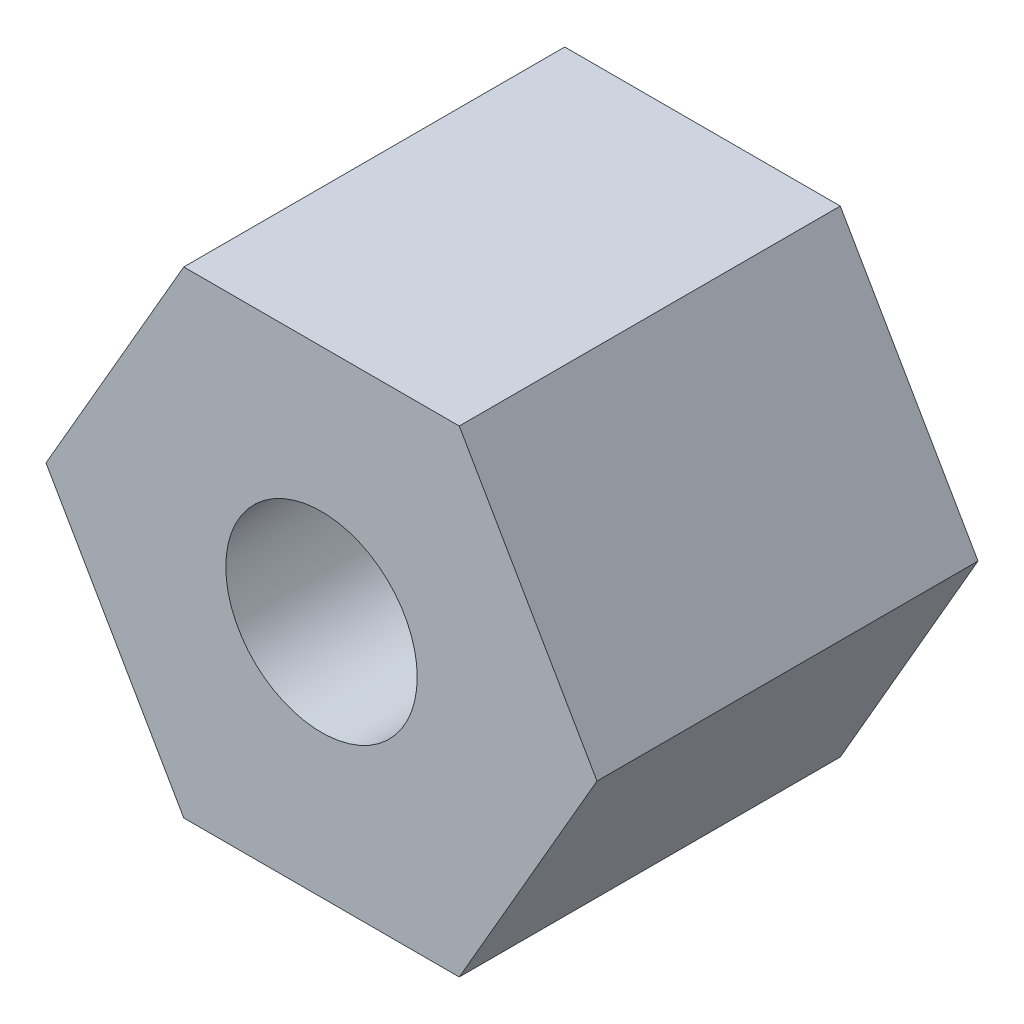
ISO-10303-21;
HEADER;
FILE_DESCRIPTION(('STEP AP214'),'2;1');
FILE_NAME('part.step','',(''),(''),'','','');
FILE_SCHEMA(('AUTOMOTIVE_DESIGN { 1 0 10303 214 1 1 1 1 }'));
ENDSEC;
DATA;
#1=APPLICATION_CONTEXT('core data for automotive mechanical design processes');
#2=APPLICATION_PROTOCOL_DEFINITION('international standard','automotive_design',2000,#1);
#3=PRODUCT_CONTEXT('',#1,'mechanical');
#4=PRODUCT('Part','Part','',(#3));
#5=PRODUCT_RELATED_PRODUCT_CATEGORY('part','',(#4));
#6=PRODUCT_DEFINITION_FORMATION('','',#4);
#7=PRODUCT_DEFINITION_CONTEXT('part definition',#1,'design');
#8=PRODUCT_DEFINITION('design','',#6,#7);
#9=PRODUCT_DEFINITION_SHAPE('','',#8);
#10=(LENGTH_UNIT() NAMED_UNIT(*) SI_UNIT(.MILLI.,.METRE.));
#11=(NAMED_UNIT(*) PLANE_ANGLE_UNIT() SI_UNIT($,.RADIAN.));
#12=(NAMED_UNIT(*) SI_UNIT($,.STERADIAN.) SOLID_ANGLE_UNIT());
#13=UNCERTAINTY_MEASURE_WITH_UNIT(LENGTH_MEASURE(1.E-05),#10,'distance_accuracy_value','');
#14=(GEOMETRIC_REPRESENTATION_CONTEXT(3) GLOBAL_UNCERTAINTY_ASSIGNED_CONTEXT((#13)) GLOBAL_UNIT_ASSIGNED_CONTEXT((#10,
#11,#12)) REPRESENTATION_CONTEXT('',''));
#15=CARTESIAN_POINT('',(0.,0.,0.));
#16=DIRECTION('',(0.,0.,1.));
#17=DIRECTION('',(1.,0.,0.));
#18=AXIS2_PLACEMENT_3D('',#15,#16,#17);
#19=CARTESIAN_POINT('',(0.,0.,40.));
#20=DIRECTION('',(0.,0.,1.));
#21=DIRECTION('',(1.,0.,0.));
#22=AXIS2_PLACEMENT_3D('',#19,#20,#21);
#23=PLANE('',#22);
#24=DIRECTION('',(-0.5,0.866025403784438,0.));
#25=VECTOR('',#24,1.);
#26=CARTESIAN_POINT('',(28.9252484864003,0.,40.));
#27=LINE('',#26,#25);
#28=CARTESIAN_POINT('',(28.9252484864003,0.,40.));
#29=VERTEX_POINT('',#28);
#30=CARTESIAN_POINT('',(14.4626242432001,25.05,40.));
#31=VERTEX_POINT('',#30);
#32=EDGE_CURVE('E133',#29,#31,#27,.T.);
#33=ORIENTED_EDGE('',*,*,#32,.T.);
#34=DIRECTION('',(-1.,0.,0.));
#35=VECTOR('',#34,1.);
#36=CARTESIAN_POINT('',(14.4626242432001,25.05,40.));
#37=LINE('',#36,#35);
#38=CARTESIAN_POINT('',(-14.4626242432001,25.05,40.));
#39=VERTEX_POINT('',#38);
#40=EDGE_CURVE('E91',#31,#39,#37,.T.);
#41=ORIENTED_EDGE('',*,*,#40,.T.);
#42=DIRECTION('',(-0.5,-0.866025403784439,0.));
#43=VECTOR('',#42,1.);
#44=CARTESIAN_POINT('',(-14.4626242432001,25.05,40.));
#45=LINE('',#44,#43);
#46=CARTESIAN_POINT('',(-28.9252484864002,0.,40.));
#47=VERTEX_POINT('',#46);
#48=EDGE_CURVE('E104',#39,#47,#45,.T.);
#49=ORIENTED_EDGE('',*,*,#48,.T.);
#50=DIRECTION('',(0.5,-0.866025403784438,0.));
#51=VECTOR('',#50,1.);
#52=CARTESIAN_POINT('',(-28.9252484864002,0.,40.));
#53=LINE('',#52,#51);
#54=CARTESIAN_POINT('',(-14.4626242432001,-25.05,40.));
#55=VERTEX_POINT('',#54);
#56=EDGE_CURVE('E98',#47,#55,#53,.T.);
#57=ORIENTED_EDGE('',*,*,#56,.T.);
#58=DIRECTION('',(1.,0.,0.));
#59=VECTOR('',#58,1.);
#60=CARTESIAN_POINT('',(-14.4626242432001,-25.05,40.));
#61=LINE('',#60,#59);
#62=CARTESIAN_POINT('',(14.4626242432001,-25.05,40.));
#63=VERTEX_POINT('',#62);
#64=EDGE_CURVE('E102',#55,#63,#61,.T.);
#65=ORIENTED_EDGE('',*,*,#64,.T.);
#66=DIRECTION('',(0.5,0.866025403784439,0.));
#67=VECTOR('',#66,1.);
#68=CARTESIAN_POINT('',(14.4626242432001,-25.05,40.));
#69=LINE('',#68,#67);
#70=EDGE_CURVE('E54',#63,#29,#69,.T.);
#71=ORIENTED_EDGE('',*,*,#70,.T.);
#72=EDGE_LOOP('',(#33,#41,#49,#57,#65,#71));
#73=FACE_BOUND('',#72,.T.);
#74=CARTESIAN_POINT('',(0.,0.,40.));
#75=DIRECTION('',(0.,0.,1.));
#76=DIRECTION('',(1.,0.,0.));
#77=AXIS2_PLACEMENT_3D('',#74,#75,#76);
#78=CIRCLE('',#77,10.05);
#79=CARTESIAN_POINT('',(10.05,0.,40.));
#80=VERTEX_POINT('',#79);
#81=EDGE_CURVE('E126',#80,#80,#78,.T.);
#82=ORIENTED_EDGE('',*,*,#81,.F.);
#83=EDGE_LOOP('',(#82));
#84=FACE_BOUND('',#83,.T.);
#85=ADVANCED_FACE('F37',(#73,#84),#23,.T.);
#86=CARTESIAN_POINT('',(0.,0.,0.));
#87=DIRECTION('',(0.,0.,1.));
#88=DIRECTION('',(1.,0.,0.));
#89=AXIS2_PLACEMENT_3D('',#86,#87,#88);
#90=PLANE('',#89);
#91=DIRECTION('',(-0.5,0.866025403784438,0.));
#92=VECTOR('',#91,1.);
#93=CARTESIAN_POINT('',(28.9252484864003,0.,0.));
#94=LINE('',#93,#92);
#95=CARTESIAN_POINT('',(28.9252484864003,0.,0.));
#96=VERTEX_POINT('',#95);
#97=CARTESIAN_POINT('',(14.4626242432001,25.05,0.));
#98=VERTEX_POINT('',#97);
#99=EDGE_CURVE('E122',#96,#98,#94,.T.);
#100=ORIENTED_EDGE('',*,*,#99,.F.);
#101=DIRECTION('',(0.5,0.866025403784439,0.));
#102=VECTOR('',#101,1.);
#103=CARTESIAN_POINT('',(14.4626242432001,-25.05,0.));
#104=LINE('',#103,#102);
#105=CARTESIAN_POINT('',(14.4626242432001,-25.05,0.));
#106=VERTEX_POINT('',#105);
#107=EDGE_CURVE('E83',#106,#96,#104,.T.);
#108=ORIENTED_EDGE('',*,*,#107,.F.);
#109=DIRECTION('',(1.,0.,0.));
#110=VECTOR('',#109,1.);
#111=CARTESIAN_POINT('',(-14.4626242432001,-25.05,0.));
#112=LINE('',#111,#110);
#113=CARTESIAN_POINT('',(-14.4626242432001,-25.05,0.));
#114=VERTEX_POINT('',#113);
#115=EDGE_CURVE('E77',#114,#106,#112,.T.);
#116=ORIENTED_EDGE('',*,*,#115,.F.);
#117=DIRECTION('',(0.5,-0.866025403784438,0.));
#118=VECTOR('',#117,1.);
#119=CARTESIAN_POINT('',(-28.9252484864002,0.,0.));
#120=LINE('',#119,#118);
#121=CARTESIAN_POINT('',(-28.9252484864002,0.,0.));
#122=VERTEX_POINT('',#121);
#123=EDGE_CURVE('E112',#122,#114,#120,.T.);
#124=ORIENTED_EDGE('',*,*,#123,.F.);
#125=DIRECTION('',(-0.5,-0.866025403784439,0.));
#126=VECTOR('',#125,1.);
#127=CARTESIAN_POINT('',(-14.4626242432001,25.05,0.));
#128=LINE('',#127,#126);
#129=CARTESIAN_POINT('',(-14.4626242432001,25.05,0.));
#130=VERTEX_POINT('',#129);
#131=EDGE_CURVE('E128',#130,#122,#128,.T.);
#132=ORIENTED_EDGE('',*,*,#131,.F.);
#133=DIRECTION('',(-1.,0.,0.));
#134=VECTOR('',#133,1.);
#135=CARTESIAN_POINT('',(14.4626242432001,25.05,0.));
#136=LINE('',#135,#134);
#137=EDGE_CURVE('E125',#98,#130,#136,.T.);
#138=ORIENTED_EDGE('',*,*,#137,.F.);
#139=EDGE_LOOP('',(#100,#108,#116,#124,#132,#138));
#140=FACE_BOUND('',#139,.T.);
#141=CARTESIAN_POINT('',(0.,0.,0.));
#142=DIRECTION('',(0.,0.,1.));
#143=DIRECTION('',(1.,0.,0.));
#144=AXIS2_PLACEMENT_3D('',#141,#142,#143);
#145=CIRCLE('',#144,10.05);
#146=CARTESIAN_POINT('',(10.05,0.,0.));
#147=VERTEX_POINT('',#146);
#148=EDGE_CURVE('E244',#147,#147,#145,.T.);
#149=ORIENTED_EDGE('',*,*,#148,.T.);
#150=EDGE_LOOP('',(#149));
#151=FACE_BOUND('',#150,.T.);
#152=ADVANCED_FACE('F142',(#140,#151),#90,.F.);
#153=CARTESIAN_POINT('',(28.9252484864003,0.,40.));
#154=DIRECTION('',(-0.866025403784438,-0.5,0.));
#155=DIRECTION('',(0.5,-0.866025403784439,0.));
#156=AXIS2_PLACEMENT_3D('',#153,#154,#155);
#157=PLANE('',#156);
#158=ORIENTED_EDGE('',*,*,#99,.T.);
#159=DIRECTION('',(0.,0.,-1.));
#160=VECTOR('',#159,1.);
#161=CARTESIAN_POINT('',(14.4626242432001,25.05,40.));
#162=LINE('',#161,#160);
#163=EDGE_CURVE('E11',#31,#98,#162,.T.);
#164=ORIENTED_EDGE('',*,*,#163,.F.);
#165=ORIENTED_EDGE('',*,*,#32,.F.);
#166=DIRECTION('',(0.,0.,-1.));
#167=VECTOR('',#166,1.);
#168=CARTESIAN_POINT('',(28.9252484864003,0.,40.));
#169=LINE('',#168,#167);
#170=EDGE_CURVE('E118',#29,#96,#169,.T.);
#171=ORIENTED_EDGE('',*,*,#170,.T.);
#172=EDGE_LOOP('',(#158,#164,#165,#171));
#173=FACE_BOUND('',#172,.T.);
#174=ADVANCED_FACE('F39',(#173),#157,.F.);
#175=CARTESIAN_POINT('',(14.4626242432001,25.05,40.));
#176=DIRECTION('',(0.,-1.,0.));
#177=DIRECTION('',(1.,0.,0.));
#178=AXIS2_PLACEMENT_3D('',#175,#176,#177);
#179=PLANE('',#178);
#180=ORIENTED_EDGE('',*,*,#137,.T.);
#181=DIRECTION('',(0.,0.,-1.));
#182=VECTOR('',#181,1.);
#183=CARTESIAN_POINT('',(-14.4626242432001,25.05,40.));
#184=LINE('',#183,#182);
#185=EDGE_CURVE('E46',#39,#130,#184,.T.);
#186=ORIENTED_EDGE('',*,*,#185,.F.);
#187=ORIENTED_EDGE('',*,*,#40,.F.);
#188=ORIENTED_EDGE('',*,*,#163,.T.);
#189=EDGE_LOOP('',(#180,#186,#187,#188));
#190=FACE_BOUND('',#189,.T.);
#191=ADVANCED_FACE('F167',(#190),#179,.F.);
#192=CARTESIAN_POINT('',(-14.4626242432001,25.05,40.));
#193=DIRECTION('',(0.866025403784439,-0.5,0.));
#194=DIRECTION('',(0.5,0.866025403784439,0.));
#195=AXIS2_PLACEMENT_3D('',#192,#193,#194);
#196=PLANE('',#195);
#197=ORIENTED_EDGE('',*,*,#131,.T.);
#198=DIRECTION('',(0.,0.,-1.));
#199=VECTOR('',#198,1.);
#200=CARTESIAN_POINT('',(-28.9252484864002,0.,40.));
#201=LINE('',#200,#199);
#202=EDGE_CURVE('E113',#47,#122,#201,.T.);
#203=ORIENTED_EDGE('',*,*,#202,.F.);
#204=ORIENTED_EDGE('',*,*,#48,.F.);
#205=ORIENTED_EDGE('',*,*,#185,.T.);
#206=EDGE_LOOP('',(#197,#203,#204,#205));
#207=FACE_BOUND('',#206,.T.);
#208=ADVANCED_FACE('F139',(#207),#196,.F.);
#209=CARTESIAN_POINT('',(-28.9252484864002,0.,40.));
#210=DIRECTION('',(0.866025403784438,0.5,0.));
#211=DIRECTION('',(-0.5,0.866025403784438,0.));
#212=AXIS2_PLACEMENT_3D('',#209,#210,#211);
#213=PLANE('',#212);
#214=ORIENTED_EDGE('',*,*,#123,.T.);
#215=DIRECTION('',(0.,0.,-1.));
#216=VECTOR('',#215,1.);
#217=CARTESIAN_POINT('',(-14.4626242432001,-25.05,40.));
#218=LINE('',#217,#216);
#219=EDGE_CURVE('E109',#55,#114,#218,.T.);
#220=ORIENTED_EDGE('',*,*,#219,.F.);
#221=ORIENTED_EDGE('',*,*,#56,.F.);
#222=ORIENTED_EDGE('',*,*,#202,.T.);
#223=EDGE_LOOP('',(#214,#220,#221,#222));
#224=FACE_BOUND('',#223,.T.);
#225=ADVANCED_FACE('F110',(#224),#213,.F.);
#226=CARTESIAN_POINT('',(-14.4626242432001,-25.05,40.));
#227=DIRECTION('',(0.,1.,0.));
#228=DIRECTION('',(-1.,0.,0.));
#229=AXIS2_PLACEMENT_3D('',#226,#227,#228);
#230=PLANE('',#229);
#231=ORIENTED_EDGE('',*,*,#115,.T.);
#232=DIRECTION('',(0.,0.,-1.));
#233=VECTOR('',#232,1.);
#234=CARTESIAN_POINT('',(14.4626242432001,-25.05,40.));
#235=LINE('',#234,#233);
#236=EDGE_CURVE('E114',#63,#106,#235,.T.);
#237=ORIENTED_EDGE('',*,*,#236,.F.);
#238=ORIENTED_EDGE('',*,*,#64,.F.);
#239=ORIENTED_EDGE('',*,*,#219,.T.);
#240=EDGE_LOOP('',(#231,#237,#238,#239));
#241=FACE_BOUND('',#240,.T.);
#242=ADVANCED_FACE('F116',(#241),#230,.F.);
#243=CARTESIAN_POINT('',(14.4626242432001,-25.05,40.));
#244=DIRECTION('',(-0.866025403784439,0.5,0.));
#245=DIRECTION('',(-0.5,-0.866025403784439,0.));
#246=AXIS2_PLACEMENT_3D('',#243,#244,#245);
#247=PLANE('',#246);
#248=ORIENTED_EDGE('',*,*,#107,.T.);
#249=ORIENTED_EDGE('',*,*,#170,.F.);
#250=ORIENTED_EDGE('',*,*,#70,.F.);
#251=ORIENTED_EDGE('',*,*,#236,.T.);
#252=EDGE_LOOP('',(#248,#249,#250,#251));
#253=FACE_BOUND('',#252,.T.);
#254=ADVANCED_FACE('F147',(#253),#247,.F.);
#255=CARTESIAN_POINT('',(0.,0.,40.));
#256=DIRECTION('',(0.,0.,-1.));
#257=DIRECTION('',(-1.,0.,0.));
#258=AXIS2_PLACEMENT_3D('',#255,#256,#257);
#259=CYLINDRICAL_SURFACE('',#258,10.05);
#260=ORIENTED_EDGE('',*,*,#81,.T.);
#261=EDGE_LOOP('',(#260));
#262=FACE_BOUND('',#261,.T.);
#263=ORIENTED_EDGE('',*,*,#148,.F.);
#264=EDGE_LOOP('',(#263));
#265=FACE_BOUND('',#264,.T.);
#266=ADVANCED_FACE('F149',(#262,#265),#259,.F.);
#267=CLOSED_SHELL('',(#85,#152,#174,#191,#208,#225,#242,#254,#266));
#268=MANIFOLD_SOLID_BREP('B2',#267);
#269=ADVANCED_BREP_SHAPE_REPRESENTATION('',(#18,#268),#14);
#270=SHAPE_DEFINITION_REPRESENTATION(#9,#269);
ENDSEC;
END-ISO-10303-21;
